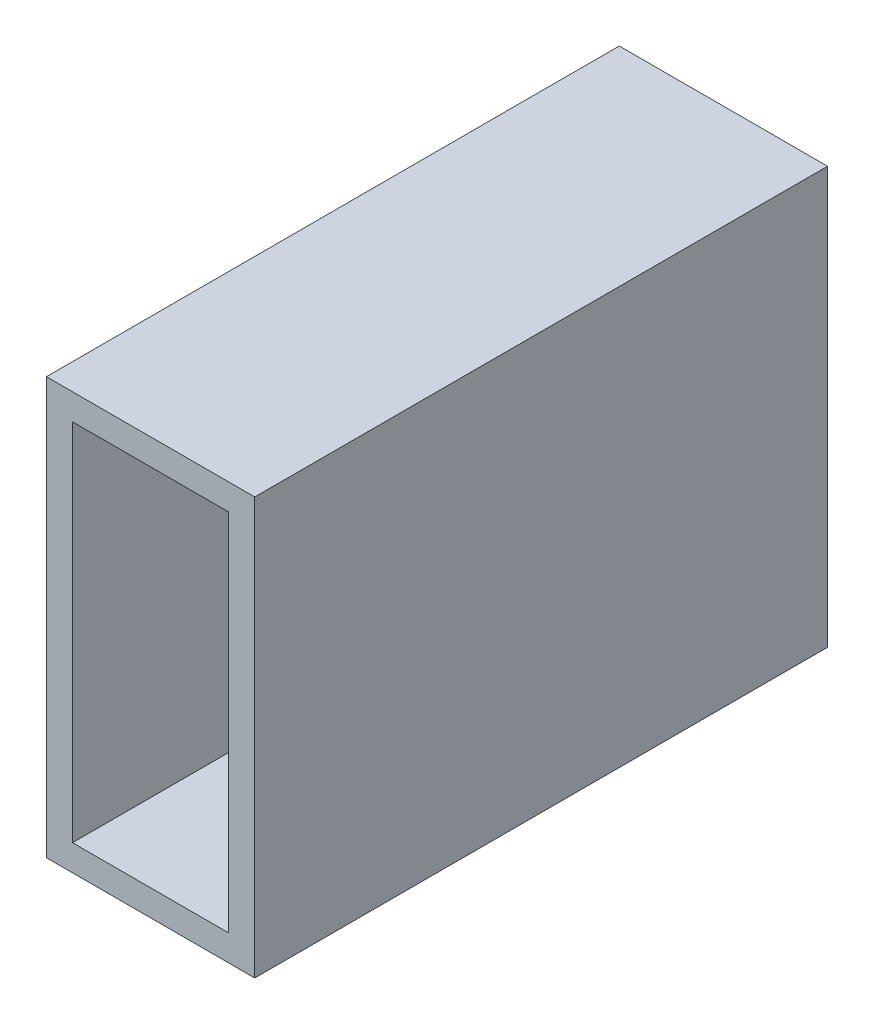
ISO-10303-21;
HEADER;
FILE_DESCRIPTION(('STEP AP214'),'2;1');
FILE_NAME('part.step','',(''),(''),'','','');
FILE_SCHEMA(('AUTOMOTIVE_DESIGN { 1 0 10303 214 1 1 1 1 }'));
ENDSEC;
DATA;
#1=APPLICATION_CONTEXT('core data for automotive mechanical design processes');
#2=APPLICATION_PROTOCOL_DEFINITION('international standard','automotive_design',2000,#1);
#3=PRODUCT_CONTEXT('',#1,'mechanical');
#4=PRODUCT('Part','Part','',(#3));
#5=PRODUCT_RELATED_PRODUCT_CATEGORY('part','',(#4));
#6=PRODUCT_DEFINITION_FORMATION('','',#4);
#7=PRODUCT_DEFINITION_CONTEXT('part definition',#1,'design');
#8=PRODUCT_DEFINITION('design','',#6,#7);
#9=PRODUCT_DEFINITION_SHAPE('','',#8);
#10=(LENGTH_UNIT() NAMED_UNIT(*) SI_UNIT(.MILLI.,.METRE.));
#11=(NAMED_UNIT(*) PLANE_ANGLE_UNIT() SI_UNIT($,.RADIAN.));
#12=(NAMED_UNIT(*) SI_UNIT($,.STERADIAN.) SOLID_ANGLE_UNIT());
#13=UNCERTAINTY_MEASURE_WITH_UNIT(LENGTH_MEASURE(1.E-05),#10,'distance_accuracy_value','');
#14=(GEOMETRIC_REPRESENTATION_CONTEXT(3) GLOBAL_UNCERTAINTY_ASSIGNED_CONTEXT((#13)) GLOBAL_UNIT_ASSIGNED_CONTEXT((#10,
#11,#12)) REPRESENTATION_CONTEXT('',''));
#15=CARTESIAN_POINT('',(0.,0.,0.));
#16=DIRECTION('',(0.,0.,1.));
#17=DIRECTION('',(1.,0.,0.));
#18=AXIS2_PLACEMENT_3D('',#15,#16,#17);
#19=CARTESIAN_POINT('',(0.,0.,69.85));
#20=DIRECTION('',(0.,0.,-1.));
#21=DIRECTION('',(-1.,0.,0.));
#22=AXIS2_PLACEMENT_3D('',#19,#20,#21);
#23=PLANE('',#22);
#24=DIRECTION('',(0.,-1.,0.));
#25=VECTOR('',#24,1.);
#26=CARTESIAN_POINT('',(0.,0.,69.85));
#27=LINE('',#26,#25);
#28=CARTESIAN_POINT('',(0.,50.8,69.85));
#29=VERTEX_POINT('',#28);
#30=CARTESIAN_POINT('',(0.,0.,69.85));
#31=VERTEX_POINT('',#30);
#32=EDGE_CURVE('E134',#29,#31,#27,.T.);
#33=ORIENTED_EDGE('',*,*,#32,.T.);
#34=DIRECTION('',(1.,0.,0.));
#35=VECTOR('',#34,1.);
#36=CARTESIAN_POINT('',(0.,0.,69.85));
#37=LINE('',#36,#35);
#38=CARTESIAN_POINT('',(25.4,0.,69.85));
#39=VERTEX_POINT('',#38);
#40=EDGE_CURVE('E137',#31,#39,#37,.T.);
#41=ORIENTED_EDGE('',*,*,#40,.T.);
#42=DIRECTION('',(0.,1.,0.));
#43=VECTOR('',#42,1.);
#44=CARTESIAN_POINT('',(25.4,0.,69.85));
#45=LINE('',#44,#43);
#46=CARTESIAN_POINT('',(25.4,50.8,69.85));
#47=VERTEX_POINT('',#46);
#48=EDGE_CURVE('E140',#39,#47,#45,.T.);
#49=ORIENTED_EDGE('',*,*,#48,.T.);
#50=DIRECTION('',(-1.,0.,0.));
#51=VECTOR('',#50,1.);
#52=CARTESIAN_POINT('',(0.,50.8,69.85));
#53=LINE('',#52,#51);
#54=EDGE_CURVE('E142',#47,#29,#53,.T.);
#55=ORIENTED_EDGE('',*,*,#54,.T.);
#56=EDGE_LOOP('',(#33,#41,#49,#55));
#57=FACE_BOUND('',#56,.T.);
#58=DIRECTION('',(0.,-1.,0.));
#59=VECTOR('',#58,1.);
#60=CARTESIAN_POINT('',(3.175,3.175,69.85));
#61=LINE('',#60,#59);
#62=CARTESIAN_POINT('',(3.175,47.625,69.85));
#63=VERTEX_POINT('',#62);
#64=CARTESIAN_POINT('',(3.175,3.175,69.85));
#65=VERTEX_POINT('',#64);
#66=EDGE_CURVE('E98',#63,#65,#61,.T.);
#67=ORIENTED_EDGE('',*,*,#66,.F.);
#68=DIRECTION('',(-1.,0.,0.));
#69=VECTOR('',#68,1.);
#70=CARTESIAN_POINT('',(3.175,47.625,69.85));
#71=LINE('',#70,#69);
#72=CARTESIAN_POINT('',(22.225,47.625,69.85));
#73=VERTEX_POINT('',#72);
#74=EDGE_CURVE('E120',#73,#63,#71,.T.);
#75=ORIENTED_EDGE('',*,*,#74,.F.);
#76=DIRECTION('',(0.,1.,0.));
#77=VECTOR('',#76,1.);
#78=CARTESIAN_POINT('',(22.225,3.175,69.85));
#79=LINE('',#78,#77);
#80=CARTESIAN_POINT('',(22.225,3.175,69.85));
#81=VERTEX_POINT('',#80);
#82=EDGE_CURVE('E118',#81,#73,#79,.T.);
#83=ORIENTED_EDGE('',*,*,#82,.F.);
#84=DIRECTION('',(1.,0.,0.));
#85=VECTOR('',#84,1.);
#86=CARTESIAN_POINT('',(3.175,3.175,69.85));
#87=LINE('',#86,#85);
#88=EDGE_CURVE('E106',#65,#81,#87,.T.);
#89=ORIENTED_EDGE('',*,*,#88,.F.);
#90=EDGE_LOOP('',(#67,#75,#83,#89));
#91=FACE_BOUND('',#90,.T.);
#92=ADVANCED_FACE('F33',(#57,#91),#23,.F.);
#93=CARTESIAN_POINT('',(0.,0.,0.));
#94=DIRECTION('',(0.,0.,-1.));
#95=DIRECTION('',(-1.,0.,0.));
#96=AXIS2_PLACEMENT_3D('',#93,#94,#95);
#97=PLANE('',#96);
#98=DIRECTION('',(0.,-1.,0.));
#99=VECTOR('',#98,1.);
#100=CARTESIAN_POINT('',(0.,0.,0.));
#101=LINE('',#100,#99);
#102=CARTESIAN_POINT('',(0.,50.8,0.));
#103=VERTEX_POINT('',#102);
#104=CARTESIAN_POINT('',(0.,0.,0.));
#105=VERTEX_POINT('',#104);
#106=EDGE_CURVE('E114',#103,#105,#101,.T.);
#107=ORIENTED_EDGE('',*,*,#106,.F.);
#108=DIRECTION('',(-1.,0.,0.));
#109=VECTOR('',#108,1.);
#110=CARTESIAN_POINT('',(0.,50.8,0.));
#111=LINE('',#110,#109);
#112=CARTESIAN_POINT('',(25.4,50.8,0.));
#113=VERTEX_POINT('',#112);
#114=EDGE_CURVE('E138',#113,#103,#111,.T.);
#115=ORIENTED_EDGE('',*,*,#114,.F.);
#116=DIRECTION('',(0.,1.,0.));
#117=VECTOR('',#116,1.);
#118=CARTESIAN_POINT('',(25.4,0.,0.));
#119=LINE('',#118,#117);
#120=CARTESIAN_POINT('',(25.4,0.,0.));
#121=VERTEX_POINT('',#120);
#122=EDGE_CURVE('E149',#121,#113,#119,.T.);
#123=ORIENTED_EDGE('',*,*,#122,.F.);
#124=DIRECTION('',(1.,0.,0.));
#125=VECTOR('',#124,1.);
#126=CARTESIAN_POINT('',(0.,0.,0.));
#127=LINE('',#126,#125);
#128=EDGE_CURVE('E147',#105,#121,#127,.T.);
#129=ORIENTED_EDGE('',*,*,#128,.F.);
#130=EDGE_LOOP('',(#107,#115,#123,#129));
#131=FACE_BOUND('',#130,.T.);
#132=DIRECTION('',(-1.,0.,0.));
#133=VECTOR('',#132,1.);
#134=CARTESIAN_POINT('',(3.175,47.625,0.));
#135=LINE('',#134,#133);
#136=CARTESIAN_POINT('',(22.225,47.625,0.));
#137=VERTEX_POINT('',#136);
#138=CARTESIAN_POINT('',(3.175,47.625,0.));
#139=VERTEX_POINT('',#138);
#140=EDGE_CURVE('E107',#137,#139,#135,.T.);
#141=ORIENTED_EDGE('',*,*,#140,.T.);
#142=DIRECTION('',(0.,-1.,0.));
#143=VECTOR('',#142,1.);
#144=CARTESIAN_POINT('',(3.175,3.175,0.));
#145=LINE('',#144,#143);
#146=CARTESIAN_POINT('',(3.175,3.175,0.));
#147=VERTEX_POINT('',#146);
#148=EDGE_CURVE('E56',#139,#147,#145,.T.);
#149=ORIENTED_EDGE('',*,*,#148,.T.);
#150=DIRECTION('',(1.,0.,0.));
#151=VECTOR('',#150,1.);
#152=CARTESIAN_POINT('',(3.175,3.175,0.));
#153=LINE('',#152,#151);
#154=CARTESIAN_POINT('',(22.225,3.175,0.));
#155=VERTEX_POINT('',#154);
#156=EDGE_CURVE('E113',#147,#155,#153,.T.);
#157=ORIENTED_EDGE('',*,*,#156,.T.);
#158=DIRECTION('',(0.,1.,0.));
#159=VECTOR('',#158,1.);
#160=CARTESIAN_POINT('',(22.225,3.175,0.));
#161=LINE('',#160,#159);
#162=EDGE_CURVE('E126',#155,#137,#161,.T.);
#163=ORIENTED_EDGE('',*,*,#162,.T.);
#164=EDGE_LOOP('',(#141,#149,#157,#163));
#165=FACE_BOUND('',#164,.T.);
#166=ADVANCED_FACE('F167',(#131,#165),#97,.T.);
#167=CARTESIAN_POINT('',(0.,0.,69.85));
#168=DIRECTION('',(1.,0.,0.));
#169=DIRECTION('',(0.,0.,-1.));
#170=AXIS2_PLACEMENT_3D('',#167,#168,#169);
#171=PLANE('',#170);
#172=ORIENTED_EDGE('',*,*,#106,.T.);
#173=DIRECTION('',(0.,0.,-1.));
#174=VECTOR('',#173,1.);
#175=CARTESIAN_POINT('',(0.,0.,69.85));
#176=LINE('',#175,#174);
#177=EDGE_CURVE('E11',#31,#105,#176,.T.);
#178=ORIENTED_EDGE('',*,*,#177,.F.);
#179=ORIENTED_EDGE('',*,*,#32,.F.);
#180=DIRECTION('',(0.,0.,-1.));
#181=VECTOR('',#180,1.);
#182=CARTESIAN_POINT('',(0.,50.8,69.85));
#183=LINE('',#182,#181);
#184=EDGE_CURVE('E144',#29,#103,#183,.T.);
#185=ORIENTED_EDGE('',*,*,#184,.T.);
#186=EDGE_LOOP('',(#172,#178,#179,#185));
#187=FACE_BOUND('',#186,.T.);
#188=ADVANCED_FACE('F35',(#187),#171,.F.);
#189=CARTESIAN_POINT('',(0.,0.,69.85));
#190=DIRECTION('',(0.,1.,0.));
#191=DIRECTION('',(0.,0.,1.));
#192=AXIS2_PLACEMENT_3D('',#189,#190,#191);
#193=PLANE('',#192);
#194=ORIENTED_EDGE('',*,*,#128,.T.);
#195=DIRECTION('',(0.,0.,-1.));
#196=VECTOR('',#195,1.);
#197=CARTESIAN_POINT('',(25.4,0.,69.85));
#198=LINE('',#197,#196);
#199=EDGE_CURVE('E41',#39,#121,#198,.T.);
#200=ORIENTED_EDGE('',*,*,#199,.F.);
#201=ORIENTED_EDGE('',*,*,#40,.F.);
#202=ORIENTED_EDGE('',*,*,#177,.T.);
#203=EDGE_LOOP('',(#194,#200,#201,#202));
#204=FACE_BOUND('',#203,.T.);
#205=ADVANCED_FACE('F177',(#204),#193,.F.);
#206=CARTESIAN_POINT('',(25.4,0.,69.85));
#207=DIRECTION('',(-1.,0.,0.));
#208=DIRECTION('',(0.,0.,1.));
#209=AXIS2_PLACEMENT_3D('',#206,#207,#208);
#210=PLANE('',#209);
#211=ORIENTED_EDGE('',*,*,#122,.T.);
#212=DIRECTION('',(0.,0.,-1.));
#213=VECTOR('',#212,1.);
#214=CARTESIAN_POINT('',(25.4,50.8,69.85));
#215=LINE('',#214,#213);
#216=EDGE_CURVE('E154',#47,#113,#215,.T.);
#217=ORIENTED_EDGE('',*,*,#216,.F.);
#218=ORIENTED_EDGE('',*,*,#48,.F.);
#219=ORIENTED_EDGE('',*,*,#199,.T.);
#220=EDGE_LOOP('',(#211,#217,#218,#219));
#221=FACE_BOUND('',#220,.T.);
#222=ADVANCED_FACE('F161',(#221),#210,.F.);
#223=CARTESIAN_POINT('',(0.,50.8,69.85));
#224=DIRECTION('',(0.,-1.,0.));
#225=DIRECTION('',(0.,0.,-1.));
#226=AXIS2_PLACEMENT_3D('',#223,#224,#225);
#227=PLANE('',#226);
#228=ORIENTED_EDGE('',*,*,#114,.T.);
#229=ORIENTED_EDGE('',*,*,#184,.F.);
#230=ORIENTED_EDGE('',*,*,#54,.F.);
#231=ORIENTED_EDGE('',*,*,#216,.T.);
#232=EDGE_LOOP('',(#228,#229,#230,#231));
#233=FACE_BOUND('',#232,.T.);
#234=ADVANCED_FACE('F171',(#233),#227,.F.);
#235=CARTESIAN_POINT('',(3.175,3.175,69.85));
#236=DIRECTION('',(1.,0.,0.));
#237=DIRECTION('',(0.,0.,-1.));
#238=AXIS2_PLACEMENT_3D('',#235,#236,#237);
#239=PLANE('',#238);
#240=ORIENTED_EDGE('',*,*,#148,.F.);
#241=DIRECTION('',(0.,0.,-1.));
#242=VECTOR('',#241,1.);
#243=CARTESIAN_POINT('',(3.175,47.625,69.85));
#244=LINE('',#243,#242);
#245=EDGE_CURVE('E102',#63,#139,#244,.T.);
#246=ORIENTED_EDGE('',*,*,#245,.F.);
#247=ORIENTED_EDGE('',*,*,#66,.T.);
#248=DIRECTION('',(0.,0.,-1.));
#249=VECTOR('',#248,1.);
#250=CARTESIAN_POINT('',(3.175,3.175,69.85));
#251=LINE('',#250,#249);
#252=EDGE_CURVE('E101',#65,#147,#251,.T.);
#253=ORIENTED_EDGE('',*,*,#252,.T.);
#254=EDGE_LOOP('',(#240,#246,#247,#253));
#255=FACE_BOUND('',#254,.T.);
#256=ADVANCED_FACE('F100',(#255),#239,.T.);
#257=CARTESIAN_POINT('',(3.175,3.175,69.85));
#258=DIRECTION('',(0.,1.,0.));
#259=DIRECTION('',(0.,0.,1.));
#260=AXIS2_PLACEMENT_3D('',#257,#258,#259);
#261=PLANE('',#260);
#262=ORIENTED_EDGE('',*,*,#156,.F.);
#263=ORIENTED_EDGE('',*,*,#252,.F.);
#264=ORIENTED_EDGE('',*,*,#88,.T.);
#265=DIRECTION('',(0.,0.,-1.));
#266=VECTOR('',#265,1.);
#267=CARTESIAN_POINT('',(22.225,3.175,69.85));
#268=LINE('',#267,#266);
#269=EDGE_CURVE('E115',#81,#155,#268,.T.);
#270=ORIENTED_EDGE('',*,*,#269,.T.);
#271=EDGE_LOOP('',(#262,#263,#264,#270));
#272=FACE_BOUND('',#271,.T.);
#273=ADVANCED_FACE('F110',(#272),#261,.T.);
#274=CARTESIAN_POINT('',(22.225,3.175,69.85));
#275=DIRECTION('',(-1.,0.,0.));
#276=DIRECTION('',(0.,0.,1.));
#277=AXIS2_PLACEMENT_3D('',#274,#275,#276);
#278=PLANE('',#277);
#279=ORIENTED_EDGE('',*,*,#162,.F.);
#280=ORIENTED_EDGE('',*,*,#269,.F.);
#281=ORIENTED_EDGE('',*,*,#82,.T.);
#282=DIRECTION('',(0.,0.,-1.));
#283=VECTOR('',#282,1.);
#284=CARTESIAN_POINT('',(22.225,47.625,69.85));
#285=LINE('',#284,#283);
#286=EDGE_CURVE('E48',#73,#137,#285,.T.);
#287=ORIENTED_EDGE('',*,*,#286,.T.);
#288=EDGE_LOOP('',(#279,#280,#281,#287));
#289=FACE_BOUND('',#288,.T.);
#290=ADVANCED_FACE('F200',(#289),#278,.T.);
#291=CARTESIAN_POINT('',(3.175,47.625,69.85));
#292=DIRECTION('',(0.,-1.,0.));
#293=DIRECTION('',(0.,0.,-1.));
#294=AXIS2_PLACEMENT_3D('',#291,#292,#293);
#295=PLANE('',#294);
#296=ORIENTED_EDGE('',*,*,#140,.F.);
#297=ORIENTED_EDGE('',*,*,#286,.F.);
#298=ORIENTED_EDGE('',*,*,#74,.T.);
#299=ORIENTED_EDGE('',*,*,#245,.T.);
#300=EDGE_LOOP('',(#296,#297,#298,#299));
#301=FACE_BOUND('',#300,.T.);
#302=ADVANCED_FACE('F204',(#301),#295,.T.);
#303=CLOSED_SHELL('',(#92,#166,#188,#205,#222,#234,#256,#273,#290,#302));
#304=MANIFOLD_SOLID_BREP('B2',#303);
#305=ADVANCED_BREP_SHAPE_REPRESENTATION('',(#18,#304),#14);
#306=SHAPE_DEFINITION_REPRESENTATION(#9,#305);
ENDSEC;
END-ISO-10303-21;
